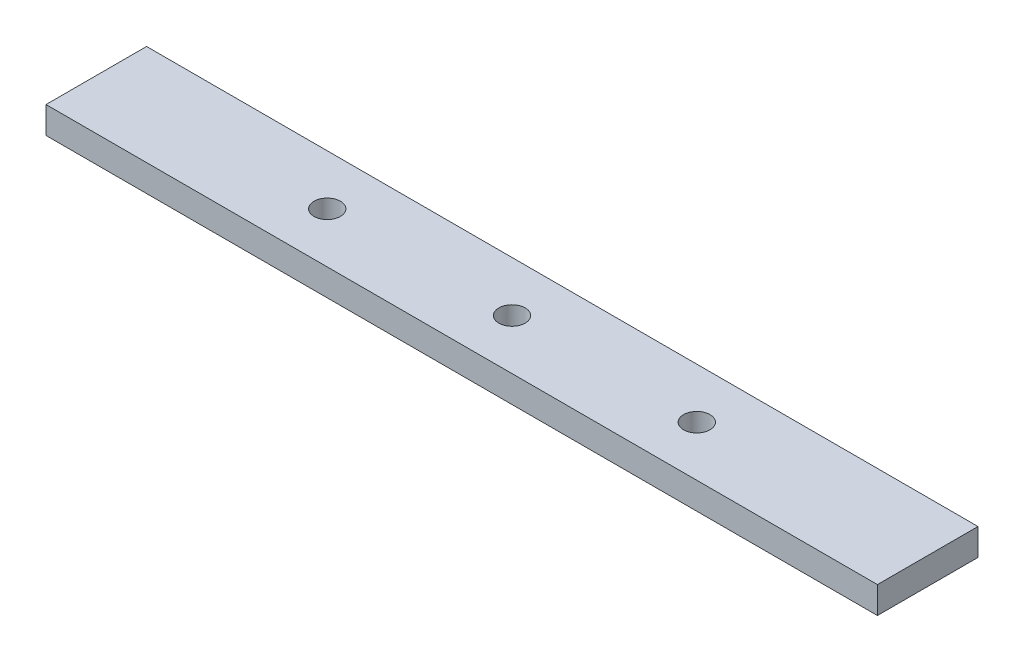
ISO-10303-21;
HEADER;
FILE_DESCRIPTION(('STEP AP214'),'2;1');
FILE_NAME('part.step','',(''),(''),'','','');
FILE_SCHEMA(('AUTOMOTIVE_DESIGN { 1 0 10303 214 1 1 1 1 }'));
ENDSEC;
DATA;
#1=APPLICATION_CONTEXT('core data for automotive mechanical design processes');
#2=APPLICATION_PROTOCOL_DEFINITION('international standard','automotive_design',2000,#1);
#3=PRODUCT_CONTEXT('',#1,'mechanical');
#4=PRODUCT('Part','Part','',(#3));
#5=PRODUCT_RELATED_PRODUCT_CATEGORY('part','',(#4));
#6=PRODUCT_DEFINITION_FORMATION('','',#4);
#7=PRODUCT_DEFINITION_CONTEXT('part definition',#1,'design');
#8=PRODUCT_DEFINITION('design','',#6,#7);
#9=PRODUCT_DEFINITION_SHAPE('','',#8);
#10=(LENGTH_UNIT() NAMED_UNIT(*) SI_UNIT(.MILLI.,.METRE.));
#11=(NAMED_UNIT(*) PLANE_ANGLE_UNIT() SI_UNIT($,.RADIAN.));
#12=(NAMED_UNIT(*) SI_UNIT($,.STERADIAN.) SOLID_ANGLE_UNIT());
#13=UNCERTAINTY_MEASURE_WITH_UNIT(LENGTH_MEASURE(1.E-05),#10,'distance_accuracy_value','');
#14=(GEOMETRIC_REPRESENTATION_CONTEXT(3) GLOBAL_UNCERTAINTY_ASSIGNED_CONTEXT((#13)) GLOBAL_UNIT_ASSIGNED_CONTEXT((#10,
#11,#12)) REPRESENTATION_CONTEXT('',''));
#15=CARTESIAN_POINT('',(0.,0.,0.));
#16=DIRECTION('',(0.,0.,1.));
#17=DIRECTION('',(1.,0.,0.));
#18=AXIS2_PLACEMENT_3D('',#15,#16,#17);
#19=CARTESIAN_POINT('',(0.,10.16,0.));
#20=DIRECTION('',(1.,0.,0.));
#21=DIRECTION('',(0.,0.,-1.));
#22=AXIS2_PLACEMENT_3D('',#19,#20,#21);
#23=PLANE('',#22);
#24=DIRECTION('',(0.,0.,1.));
#25=VECTOR('',#24,1.);
#26=CARTESIAN_POINT('',(0.,0.,0.));
#27=LINE('',#26,#25);
#28=CARTESIAN_POINT('',(0.,0.,0.));
#29=VERTEX_POINT('',#28);
#30=CARTESIAN_POINT('',(0.,0.,38.1));
#31=VERTEX_POINT('',#30);
#32=EDGE_CURVE('E114',#29,#31,#27,.T.);
#33=ORIENTED_EDGE('',*,*,#32,.T.);
#34=DIRECTION('',(0.,-1.,0.));
#35=VECTOR('',#34,1.);
#36=CARTESIAN_POINT('',(0.,10.16,38.1));
#37=LINE('',#36,#35);
#38=CARTESIAN_POINT('',(0.,10.16,38.1));
#39=VERTEX_POINT('',#38);
#40=EDGE_CURVE('E11',#39,#31,#37,.T.);
#41=ORIENTED_EDGE('',*,*,#40,.F.);
#42=DIRECTION('',(0.,0.,1.));
#43=VECTOR('',#42,1.);
#44=CARTESIAN_POINT('',(0.,10.16,0.));
#45=LINE('',#44,#43);
#46=CARTESIAN_POINT('',(0.,10.16,0.));
#47=VERTEX_POINT('',#46);
#48=EDGE_CURVE('E97',#47,#39,#45,.T.);
#49=ORIENTED_EDGE('',*,*,#48,.F.);
#50=DIRECTION('',(0.,-1.,0.));
#51=VECTOR('',#50,1.);
#52=CARTESIAN_POINT('',(0.,10.16,0.));
#53=LINE('',#52,#51);
#54=EDGE_CURVE('E110',#47,#29,#53,.T.);
#55=ORIENTED_EDGE('',*,*,#54,.T.);
#56=EDGE_LOOP('',(#33,#41,#49,#55));
#57=FACE_BOUND('',#56,.T.);
#58=ADVANCED_FACE('F43',(#57),#23,.F.);
#59=CARTESIAN_POINT('',(0.,10.16,38.1));
#60=DIRECTION('',(0.,0.,-1.));
#61=DIRECTION('',(-1.,0.,0.));
#62=AXIS2_PLACEMENT_3D('',#59,#60,#61);
#63=PLANE('',#62);
#64=DIRECTION('',(1.,0.,0.));
#65=VECTOR('',#64,1.);
#66=CARTESIAN_POINT('',(0.,0.,38.1));
#67=LINE('',#66,#65);
#68=CARTESIAN_POINT('',(314.96,0.,38.1));
#69=VERTEX_POINT('',#68);
#70=EDGE_CURVE('E102',#31,#69,#67,.T.);
#71=ORIENTED_EDGE('',*,*,#70,.T.);
#72=DIRECTION('',(0.,-1.,0.));
#73=VECTOR('',#72,1.);
#74=CARTESIAN_POINT('',(314.96,10.16,38.1));
#75=LINE('',#74,#73);
#76=CARTESIAN_POINT('',(314.96,10.16,38.1));
#77=VERTEX_POINT('',#76);
#78=EDGE_CURVE('E53',#77,#69,#75,.T.);
#79=ORIENTED_EDGE('',*,*,#78,.F.);
#80=DIRECTION('',(1.,0.,0.));
#81=VECTOR('',#80,1.);
#82=CARTESIAN_POINT('',(0.,10.16,38.1));
#83=LINE('',#82,#81);
#84=EDGE_CURVE('E92',#39,#77,#83,.T.);
#85=ORIENTED_EDGE('',*,*,#84,.F.);
#86=ORIENTED_EDGE('',*,*,#40,.T.);
#87=EDGE_LOOP('',(#71,#79,#85,#86));
#88=FACE_BOUND('',#87,.T.);
#89=ADVANCED_FACE('F101',(#88),#63,.F.);
#90=CARTESIAN_POINT('',(314.96,10.16,0.));
#91=DIRECTION('',(-1.,0.,0.));
#92=DIRECTION('',(0.,0.,1.));
#93=AXIS2_PLACEMENT_3D('',#90,#91,#92);
#94=PLANE('',#93);
#95=DIRECTION('',(0.,0.,-1.));
#96=VECTOR('',#95,1.);
#97=CARTESIAN_POINT('',(314.96,0.,0.));
#98=LINE('',#97,#96);
#99=CARTESIAN_POINT('',(314.96,0.,0.));
#100=VERTEX_POINT('',#99);
#101=EDGE_CURVE('E79',#69,#100,#98,.T.);
#102=ORIENTED_EDGE('',*,*,#101,.T.);
#103=DIRECTION('',(0.,-1.,0.));
#104=VECTOR('',#103,1.);
#105=CARTESIAN_POINT('',(314.96,10.16,0.));
#106=LINE('',#105,#104);
#107=CARTESIAN_POINT('',(314.96,10.16,0.));
#108=VERTEX_POINT('',#107);
#109=EDGE_CURVE('E104',#108,#100,#106,.T.);
#110=ORIENTED_EDGE('',*,*,#109,.F.);
#111=DIRECTION('',(0.,0.,-1.));
#112=VECTOR('',#111,1.);
#113=CARTESIAN_POINT('',(314.96,10.16,0.));
#114=LINE('',#113,#112);
#115=EDGE_CURVE('E95',#77,#108,#114,.T.);
#116=ORIENTED_EDGE('',*,*,#115,.F.);
#117=ORIENTED_EDGE('',*,*,#78,.T.);
#118=EDGE_LOOP('',(#102,#110,#116,#117));
#119=FACE_BOUND('',#118,.T.);
#120=ADVANCED_FACE('F106',(#119),#94,.F.);
#121=CARTESIAN_POINT('',(0.,10.16,0.));
#122=DIRECTION('',(0.,0.,1.));
#123=DIRECTION('',(1.,0.,0.));
#124=AXIS2_PLACEMENT_3D('',#121,#122,#123);
#125=PLANE('',#124);
#126=DIRECTION('',(-1.,0.,0.));
#127=VECTOR('',#126,1.);
#128=CARTESIAN_POINT('',(0.,0.,0.));
#129=LINE('',#128,#127);
#130=EDGE_CURVE('E85',#100,#29,#129,.T.);
#131=ORIENTED_EDGE('',*,*,#130,.T.);
#132=ORIENTED_EDGE('',*,*,#54,.F.);
#133=DIRECTION('',(-1.,0.,0.));
#134=VECTOR('',#133,1.);
#135=CARTESIAN_POINT('',(0.,10.16,0.));
#136=LINE('',#135,#134);
#137=EDGE_CURVE('E62',#108,#47,#136,.T.);
#138=ORIENTED_EDGE('',*,*,#137,.F.);
#139=ORIENTED_EDGE('',*,*,#109,.T.);
#140=EDGE_LOOP('',(#131,#132,#138,#139));
#141=FACE_BOUND('',#140,.T.);
#142=ADVANCED_FACE('F170',(#141),#125,.F.);
#143=CARTESIAN_POINT('',(0.,10.16,0.));
#144=DIRECTION('',(0.,1.,0.));
#145=DIRECTION('',(0.,0.,1.));
#146=AXIS2_PLACEMENT_3D('',#143,#144,#145);
#147=PLANE('',#146);
#148=CARTESIAN_POINT('',(87.48,10.16,19.05));
#149=DIRECTION('',(0.,1.,0.));
#150=DIRECTION('',(0.,0.,1.));
#151=AXIS2_PLACEMENT_3D('',#148,#149,#150);
#152=CIRCLE('',#151,4.99999999999999);
#153=CARTESIAN_POINT('',(87.48,10.16,24.05));
#154=VERTEX_POINT('',#153);
#155=EDGE_CURVE('E132',#154,#154,#152,.T.);
#156=ORIENTED_EDGE('',*,*,#155,.F.);
#157=EDGE_LOOP('',(#156));
#158=FACE_BOUND('',#157,.T.);
#159=CARTESIAN_POINT('',(157.48,10.16,19.05));
#160=DIRECTION('',(0.,1.,0.));
#161=DIRECTION('',(0.,0.,1.));
#162=AXIS2_PLACEMENT_3D('',#159,#160,#161);
#163=CIRCLE('',#162,4.99999999999999);
#164=CARTESIAN_POINT('',(157.48,10.16,24.05));
#165=VERTEX_POINT('',#164);
#166=EDGE_CURVE('E248',#165,#165,#163,.T.);
#167=ORIENTED_EDGE('',*,*,#166,.F.);
#168=EDGE_LOOP('',(#167));
#169=FACE_BOUND('',#168,.T.);
#170=CARTESIAN_POINT('',(227.48,10.16,19.05));
#171=DIRECTION('',(0.,1.,0.));
#172=DIRECTION('',(0.,0.,1.));
#173=AXIS2_PLACEMENT_3D('',#170,#171,#172);
#174=CIRCLE('',#173,4.99999999999999);
#175=CARTESIAN_POINT('',(227.48,10.16,24.05));
#176=VERTEX_POINT('',#175);
#177=EDGE_CURVE('E251',#176,#176,#174,.T.);
#178=ORIENTED_EDGE('',*,*,#177,.F.);
#179=EDGE_LOOP('',(#178));
#180=FACE_BOUND('',#179,.T.);
#181=ORIENTED_EDGE('',*,*,#48,.T.);
#182=ORIENTED_EDGE('',*,*,#84,.T.);
#183=ORIENTED_EDGE('',*,*,#115,.T.);
#184=ORIENTED_EDGE('',*,*,#137,.T.);
#185=EDGE_LOOP('',(#181,#182,#183,#184));
#186=FACE_BOUND('',#185,.T.);
#187=ADVANCED_FACE('F93',(#158,#169,#180,#186),#147,.T.);
#188=CARTESIAN_POINT('',(0.,0.,0.));
#189=DIRECTION('',(0.,1.,0.));
#190=DIRECTION('',(0.,0.,1.));
#191=AXIS2_PLACEMENT_3D('',#188,#189,#190);
#192=PLANE('',#191);
#193=CARTESIAN_POINT('',(87.48,0.,19.05));
#194=DIRECTION('',(0.,1.,0.));
#195=DIRECTION('',(0.,0.,1.));
#196=AXIS2_PLACEMENT_3D('',#193,#194,#195);
#197=CIRCLE('',#196,4.99999999999999);
#198=CARTESIAN_POINT('',(87.48,0.,24.05));
#199=VERTEX_POINT('',#198);
#200=EDGE_CURVE('E46',#199,#199,#197,.T.);
#201=ORIENTED_EDGE('',*,*,#200,.T.);
#202=EDGE_LOOP('',(#201));
#203=FACE_BOUND('',#202,.T.);
#204=CARTESIAN_POINT('',(157.48,0.,19.05));
#205=DIRECTION('',(0.,1.,0.));
#206=DIRECTION('',(0.,0.,1.));
#207=AXIS2_PLACEMENT_3D('',#204,#205,#206);
#208=CIRCLE('',#207,4.99999999999999);
#209=CARTESIAN_POINT('',(157.48,0.,24.05));
#210=VERTEX_POINT('',#209);
#211=EDGE_CURVE('E131',#210,#210,#208,.T.);
#212=ORIENTED_EDGE('',*,*,#211,.T.);
#213=EDGE_LOOP('',(#212));
#214=FACE_BOUND('',#213,.T.);
#215=CARTESIAN_POINT('',(227.48,0.,19.05));
#216=DIRECTION('',(0.,1.,0.));
#217=DIRECTION('',(0.,0.,1.));
#218=AXIS2_PLACEMENT_3D('',#215,#216,#217);
#219=CIRCLE('',#218,4.99999999999999);
#220=CARTESIAN_POINT('',(227.48,0.,24.05));
#221=VERTEX_POINT('',#220);
#222=EDGE_CURVE('E128',#221,#221,#219,.T.);
#223=ORIENTED_EDGE('',*,*,#222,.T.);
#224=EDGE_LOOP('',(#223));
#225=FACE_BOUND('',#224,.T.);
#226=ORIENTED_EDGE('',*,*,#32,.F.);
#227=ORIENTED_EDGE('',*,*,#130,.F.);
#228=ORIENTED_EDGE('',*,*,#101,.F.);
#229=ORIENTED_EDGE('',*,*,#70,.F.);
#230=EDGE_LOOP('',(#226,#227,#228,#229));
#231=FACE_BOUND('',#230,.T.);
#232=ADVANCED_FACE('F141',(#203,#214,#225,#231),#192,.F.);
#233=CARTESIAN_POINT('',(227.48,-37.,19.05));
#234=DIRECTION('',(0.,1.,0.));
#235=DIRECTION('',(0.,0.,1.));
#236=AXIS2_PLACEMENT_3D('',#233,#234,#235);
#237=CYLINDRICAL_SURFACE('',#236,4.99999999999999);
#238=ORIENTED_EDGE('',*,*,#177,.T.);
#239=EDGE_LOOP('',(#238));
#240=FACE_BOUND('',#239,.T.);
#241=ORIENTED_EDGE('',*,*,#222,.F.);
#242=EDGE_LOOP('',(#241));
#243=FACE_BOUND('',#242,.T.);
#244=ADVANCED_FACE('F151',(#240,#243),#237,.F.);
#245=CARTESIAN_POINT('',(157.48,-37.,19.05));
#246=DIRECTION('',(0.,1.,0.));
#247=DIRECTION('',(0.,0.,1.));
#248=AXIS2_PLACEMENT_3D('',#245,#246,#247);
#249=CYLINDRICAL_SURFACE('',#248,4.99999999999999);
#250=ORIENTED_EDGE('',*,*,#166,.T.);
#251=EDGE_LOOP('',(#250));
#252=FACE_BOUND('',#251,.T.);
#253=ORIENTED_EDGE('',*,*,#211,.F.);
#254=EDGE_LOOP('',(#253));
#255=FACE_BOUND('',#254,.T.);
#256=ADVANCED_FACE('F145',(#252,#255),#249,.F.);
#257=CARTESIAN_POINT('',(87.48,-37.,19.05));
#258=DIRECTION('',(0.,1.,0.));
#259=DIRECTION('',(0.,0.,1.));
#260=AXIS2_PLACEMENT_3D('',#257,#258,#259);
#261=CYLINDRICAL_SURFACE('',#260,4.99999999999999);
#262=ORIENTED_EDGE('',*,*,#155,.T.);
#263=EDGE_LOOP('',(#262));
#264=FACE_BOUND('',#263,.T.);
#265=ORIENTED_EDGE('',*,*,#200,.F.);
#266=EDGE_LOOP('',(#265));
#267=FACE_BOUND('',#266,.T.);
#268=ADVANCED_FACE('F143',(#264,#267),#261,.F.);
#269=CLOSED_SHELL('',(#58,#89,#120,#142,#187,#232,#244,#256,#268));
#270=MANIFOLD_SOLID_BREP('B2',#269);
#271=ADVANCED_BREP_SHAPE_REPRESENTATION('',(#18,#270),#14);
#272=SHAPE_DEFINITION_REPRESENTATION(#9,#271);
ENDSEC;
END-ISO-10303-21;
